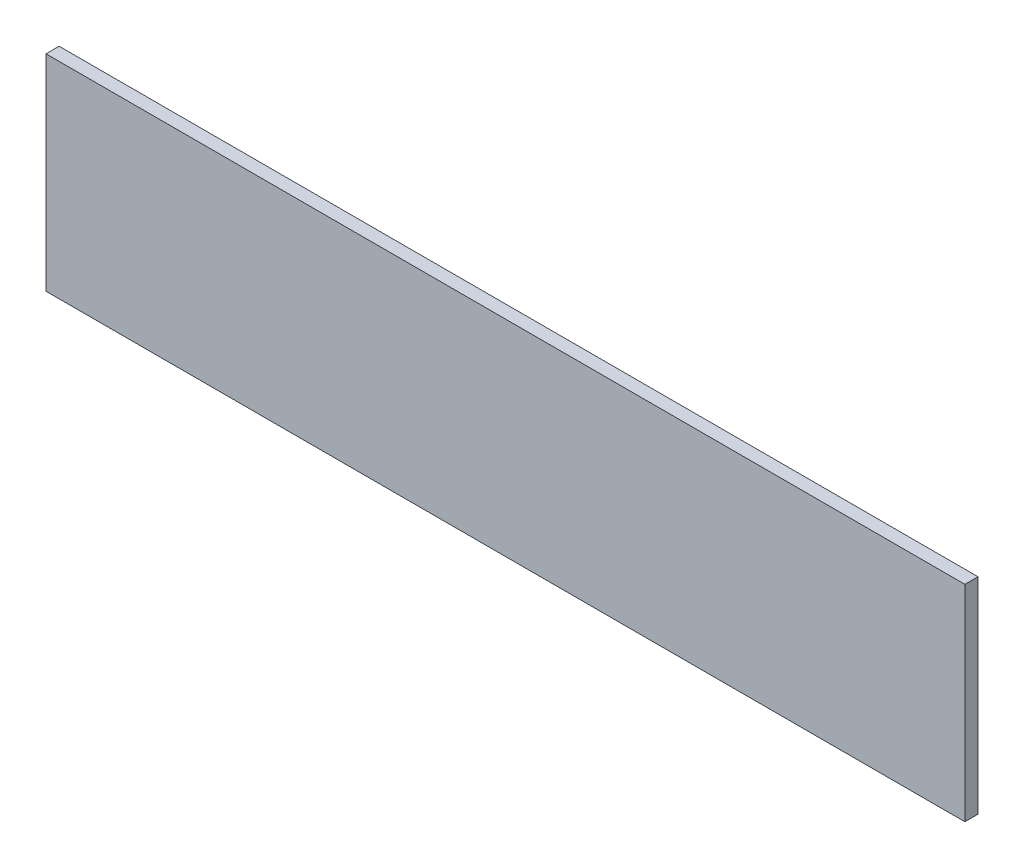
ISO-10303-21;
HEADER;
FILE_DESCRIPTION(('STEP AP214'),'2;1');
FILE_NAME('part.step','',(''),(''),'','','');
FILE_SCHEMA(('AUTOMOTIVE_DESIGN { 1 0 10303 214 1 1 1 1 }'));
ENDSEC;
DATA;
#1=APPLICATION_CONTEXT('core data for automotive mechanical design processes');
#2=APPLICATION_PROTOCOL_DEFINITION('international standard','automotive_design',2000,#1);
#3=PRODUCT_CONTEXT('',#1,'mechanical');
#4=PRODUCT('Part','Part','',(#3));
#5=PRODUCT_RELATED_PRODUCT_CATEGORY('part','',(#4));
#6=PRODUCT_DEFINITION_FORMATION('','',#4);
#7=PRODUCT_DEFINITION_CONTEXT('part definition',#1,'design');
#8=PRODUCT_DEFINITION('design','',#6,#7);
#9=PRODUCT_DEFINITION_SHAPE('','',#8);
#10=(LENGTH_UNIT() NAMED_UNIT(*) SI_UNIT(.MILLI.,.METRE.));
#11=(NAMED_UNIT(*) PLANE_ANGLE_UNIT() SI_UNIT($,.RADIAN.));
#12=(NAMED_UNIT(*) SI_UNIT($,.STERADIAN.) SOLID_ANGLE_UNIT());
#13=UNCERTAINTY_MEASURE_WITH_UNIT(LENGTH_MEASURE(1.E-05),#10,'distance_accuracy_value','');
#14=(GEOMETRIC_REPRESENTATION_CONTEXT(3) GLOBAL_UNCERTAINTY_ASSIGNED_CONTEXT((#13)) GLOBAL_UNIT_ASSIGNED_CONTEXT((#10,
#11,#12)) REPRESENTATION_CONTEXT('',''));
#15=CARTESIAN_POINT('',(0.,0.,0.));
#16=DIRECTION('',(0.,0.,1.));
#17=DIRECTION('',(1.,0.,0.));
#18=AXIS2_PLACEMENT_3D('',#15,#16,#17);
#19=CARTESIAN_POINT('',(31.4761904761905,47.,-1.95238095238095));
#20=DIRECTION('',(0.,0.,1.));
#21=DIRECTION('',(1.,0.,0.));
#22=AXIS2_PLACEMENT_3D('',#19,#20,#21);
#23=PLANE('',#22);
#24=DIRECTION('',(-1.,0.,0.));
#25=VECTOR('',#24,1.);
#26=CARTESIAN_POINT('',(31.4761904761905,0.,-1.95238095238095));
#27=LINE('',#26,#25);
#28=CARTESIAN_POINT('',(31.4761904761905,0.,-1.95238095238095));
#29=VERTEX_POINT('',#28);
#30=CARTESIAN_POINT('',(-178.52380952381,0.,-1.95238095238092));
#31=VERTEX_POINT('',#30);
#32=EDGE_CURVE('E96',#29,#31,#27,.T.);
#33=ORIENTED_EDGE('',*,*,#32,.T.);
#34=DIRECTION('',(0.,-1.,0.));
#35=VECTOR('',#34,1.);
#36=CARTESIAN_POINT('',(-178.52380952381,47.,-1.95238095238092));
#37=LINE('',#36,#35);
#38=CARTESIAN_POINT('',(-178.52380952381,47.,-1.95238095238092));
#39=VERTEX_POINT('',#38);
#40=EDGE_CURVE('E11',#39,#31,#37,.T.);
#41=ORIENTED_EDGE('',*,*,#40,.F.);
#42=DIRECTION('',(-1.,0.,0.));
#43=VECTOR('',#42,1.);
#44=CARTESIAN_POINT('',(31.4761904761905,47.,-1.95238095238095));
#45=LINE('',#44,#43);
#46=CARTESIAN_POINT('',(31.4761904761905,47.,-1.95238095238095));
#47=VERTEX_POINT('',#46);
#48=EDGE_CURVE('E84',#47,#39,#45,.T.);
#49=ORIENTED_EDGE('',*,*,#48,.F.);
#50=DIRECTION('',(0.,-1.,0.));
#51=VECTOR('',#50,1.);
#52=CARTESIAN_POINT('',(31.4761904761905,47.,-1.95238095238095));
#53=LINE('',#52,#51);
#54=EDGE_CURVE('E92',#47,#29,#53,.T.);
#55=ORIENTED_EDGE('',*,*,#54,.T.);
#56=EDGE_LOOP('',(#33,#41,#49,#55));
#57=FACE_BOUND('',#56,.T.);
#58=ADVANCED_FACE('F33',(#57),#23,.F.);
#59=CARTESIAN_POINT('',(-178.52380952381,47.,-1.95238095238092));
#60=DIRECTION('',(1.,0.,0.));
#61=DIRECTION('',(0.,0.,-1.));
#62=AXIS2_PLACEMENT_3D('',#59,#60,#61);
#63=PLANE('',#62);
#64=DIRECTION('',(0.,0.,1.));
#65=VECTOR('',#64,1.);
#66=CARTESIAN_POINT('',(-178.52380952381,0.,-1.95238095238092));
#67=LINE('',#66,#65);
#68=CARTESIAN_POINT('',(-178.52380952381,0.,1.04761904761905));
#69=VERTEX_POINT('',#68);
#70=EDGE_CURVE('E88',#31,#69,#67,.T.);
#71=ORIENTED_EDGE('',*,*,#70,.T.);
#72=DIRECTION('',(0.,-1.,0.));
#73=VECTOR('',#72,1.);
#74=CARTESIAN_POINT('',(-178.52380952381,47.,1.04761904761905));
#75=LINE('',#74,#73);
#76=CARTESIAN_POINT('',(-178.52380952381,47.,1.04761904761905));
#77=VERTEX_POINT('',#76);
#78=EDGE_CURVE('E41',#77,#69,#75,.T.);
#79=ORIENTED_EDGE('',*,*,#78,.F.);
#80=DIRECTION('',(0.,0.,1.));
#81=VECTOR('',#80,1.);
#82=CARTESIAN_POINT('',(-178.52380952381,47.,-1.95238095238092));
#83=LINE('',#82,#81);
#84=EDGE_CURVE('E79',#39,#77,#83,.T.);
#85=ORIENTED_EDGE('',*,*,#84,.F.);
#86=ORIENTED_EDGE('',*,*,#40,.T.);
#87=EDGE_LOOP('',(#71,#79,#85,#86));
#88=FACE_BOUND('',#87,.T.);
#89=ADVANCED_FACE('F87',(#88),#63,.F.);
#90=CARTESIAN_POINT('',(-178.52380952381,47.,1.04761904761905));
#91=DIRECTION('',(0.,0.,-1.));
#92=DIRECTION('',(-1.,0.,0.));
#93=AXIS2_PLACEMENT_3D('',#90,#91,#92);
#94=PLANE('',#93);
#95=DIRECTION('',(1.,0.,0.));
#96=VECTOR('',#95,1.);
#97=CARTESIAN_POINT('',(-178.52380952381,0.,1.04761904761905));
#98=LINE('',#97,#96);
#99=CARTESIAN_POINT('',(31.4761904761905,0.,1.04761904761905));
#100=VERTEX_POINT('',#99);
#101=EDGE_CURVE('E66',#69,#100,#98,.T.);
#102=ORIENTED_EDGE('',*,*,#101,.T.);
#103=DIRECTION('',(0.,-1.,0.));
#104=VECTOR('',#103,1.);
#105=CARTESIAN_POINT('',(31.4761904761905,47.,1.04761904761905));
#106=LINE('',#105,#104);
#107=CARTESIAN_POINT('',(31.4761904761905,47.,1.04761904761905));
#108=VERTEX_POINT('',#107);
#109=EDGE_CURVE('E89',#108,#100,#106,.T.);
#110=ORIENTED_EDGE('',*,*,#109,.F.);
#111=DIRECTION('',(1.,0.,0.));
#112=VECTOR('',#111,1.);
#113=CARTESIAN_POINT('',(-178.52380952381,47.,1.04761904761905));
#114=LINE('',#113,#112);
#115=EDGE_CURVE('E82',#77,#108,#114,.T.);
#116=ORIENTED_EDGE('',*,*,#115,.F.);
#117=ORIENTED_EDGE('',*,*,#78,.T.);
#118=EDGE_LOOP('',(#102,#110,#116,#117));
#119=FACE_BOUND('',#118,.T.);
#120=ADVANCED_FACE('F90',(#119),#94,.F.);
#121=CARTESIAN_POINT('',(31.4761904761905,47.,1.04761904761905));
#122=DIRECTION('',(-1.,0.,0.));
#123=DIRECTION('',(0.,0.,1.));
#124=AXIS2_PLACEMENT_3D('',#121,#122,#123);
#125=PLANE('',#124);
#126=DIRECTION('',(0.,0.,-1.));
#127=VECTOR('',#126,1.);
#128=CARTESIAN_POINT('',(31.4761904761905,0.,1.04761904761905));
#129=LINE('',#128,#127);
#130=EDGE_CURVE('E72',#100,#29,#129,.T.);
#131=ORIENTED_EDGE('',*,*,#130,.T.);
#132=ORIENTED_EDGE('',*,*,#54,.F.);
#133=DIRECTION('',(0.,0.,-1.));
#134=VECTOR('',#133,1.);
#135=CARTESIAN_POINT('',(31.4761904761905,47.,1.04761904761905));
#136=LINE('',#135,#134);
#137=EDGE_CURVE('E49',#108,#47,#136,.T.);
#138=ORIENTED_EDGE('',*,*,#137,.F.);
#139=ORIENTED_EDGE('',*,*,#109,.T.);
#140=EDGE_LOOP('',(#131,#132,#138,#139));
#141=FACE_BOUND('',#140,.T.);
#142=ADVANCED_FACE('F103',(#141),#125,.F.);
#143=CARTESIAN_POINT('',(0.,47.,0.));
#144=DIRECTION('',(0.,1.,0.));
#145=DIRECTION('',(0.,0.,1.));
#146=AXIS2_PLACEMENT_3D('',#143,#144,#145);
#147=PLANE('',#146);
#148=ORIENTED_EDGE('',*,*,#48,.T.);
#149=ORIENTED_EDGE('',*,*,#84,.T.);
#150=ORIENTED_EDGE('',*,*,#115,.T.);
#151=ORIENTED_EDGE('',*,*,#137,.T.);
#152=EDGE_LOOP('',(#148,#149,#150,#151));
#153=FACE_BOUND('',#152,.T.);
#154=ADVANCED_FACE('F80',(#153),#147,.T.);
#155=CARTESIAN_POINT('',(0.,0.,0.));
#156=DIRECTION('',(0.,1.,0.));
#157=DIRECTION('',(0.,0.,1.));
#158=AXIS2_PLACEMENT_3D('',#155,#156,#157);
#159=PLANE('',#158);
#160=ORIENTED_EDGE('',*,*,#32,.F.);
#161=ORIENTED_EDGE('',*,*,#130,.F.);
#162=ORIENTED_EDGE('',*,*,#101,.F.);
#163=ORIENTED_EDGE('',*,*,#70,.F.);
#164=EDGE_LOOP('',(#160,#161,#162,#163));
#165=FACE_BOUND('',#164,.T.);
#166=ADVANCED_FACE('F106',(#165),#159,.F.);
#167=CLOSED_SHELL('',(#58,#89,#120,#142,#154,#166));
#168=MANIFOLD_SOLID_BREP('B2',#167);
#169=ADVANCED_BREP_SHAPE_REPRESENTATION('',(#18,#168),#14);
#170=SHAPE_DEFINITION_REPRESENTATION(#9,#169);
ENDSEC;
END-ISO-10303-21;
